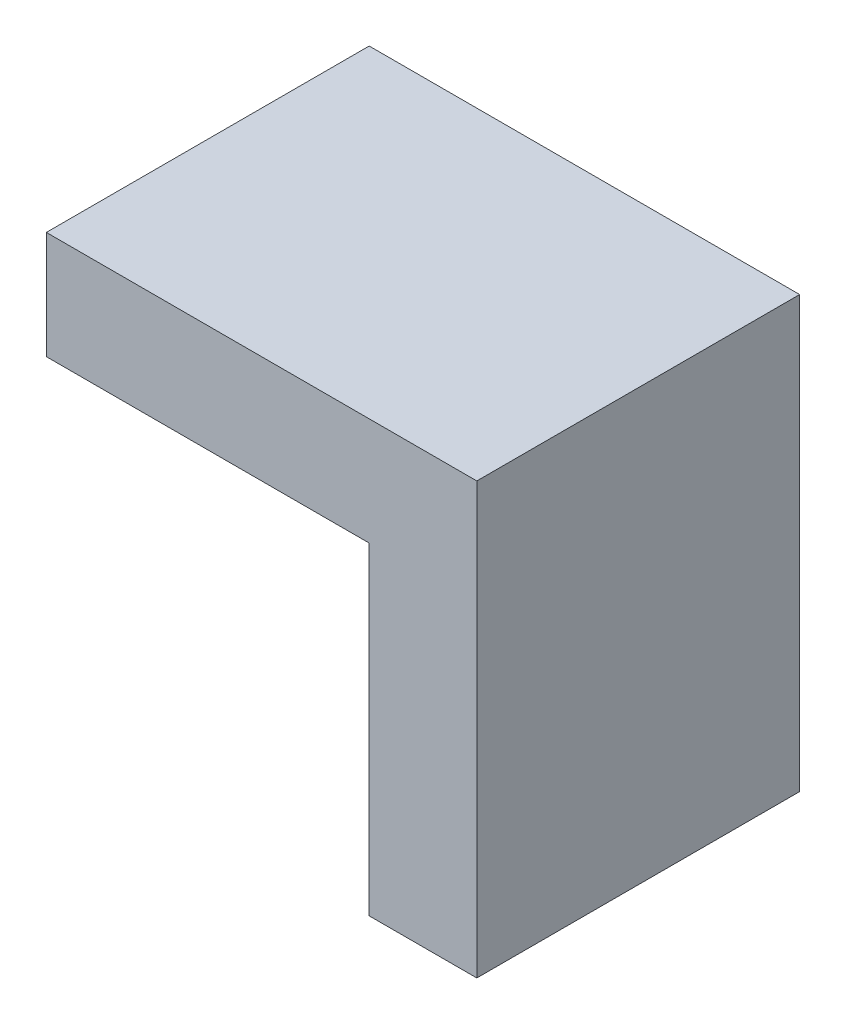
ISO-10303-21;
HEADER;
FILE_DESCRIPTION(('STEP AP214'),'2;1');
FILE_NAME('part.step','',(''),(''),'','','');
FILE_SCHEMA(('AUTOMOTIVE_DESIGN { 1 0 10303 214 1 1 1 1 }'));
ENDSEC;
DATA;
#1=APPLICATION_CONTEXT('core data for automotive mechanical design processes');
#2=APPLICATION_PROTOCOL_DEFINITION('international standard','automotive_design',2000,#1);
#3=PRODUCT_CONTEXT('',#1,'mechanical');
#4=PRODUCT('Part','Part','',(#3));
#5=PRODUCT_RELATED_PRODUCT_CATEGORY('part','',(#4));
#6=PRODUCT_DEFINITION_FORMATION('','',#4);
#7=PRODUCT_DEFINITION_CONTEXT('part definition',#1,'design');
#8=PRODUCT_DEFINITION('design','',#6,#7);
#9=PRODUCT_DEFINITION_SHAPE('','',#8);
#10=(LENGTH_UNIT() NAMED_UNIT(*) SI_UNIT(.MILLI.,.METRE.));
#11=(NAMED_UNIT(*) PLANE_ANGLE_UNIT() SI_UNIT($,.RADIAN.));
#12=(NAMED_UNIT(*) SI_UNIT($,.STERADIAN.) SOLID_ANGLE_UNIT());
#13=UNCERTAINTY_MEASURE_WITH_UNIT(LENGTH_MEASURE(1.E-05),#10,'distance_accuracy_value','');
#14=(GEOMETRIC_REPRESENTATION_CONTEXT(3) GLOBAL_UNCERTAINTY_ASSIGNED_CONTEXT((#13)) GLOBAL_UNIT_ASSIGNED_CONTEXT((#10,
#11,#12)) REPRESENTATION_CONTEXT('',''));
#15=CARTESIAN_POINT('',(0.,0.,0.));
#16=DIRECTION('',(0.,0.,1.));
#17=DIRECTION('',(1.,0.,0.));
#18=AXIS2_PLACEMENT_3D('',#15,#16,#17);
#19=CARTESIAN_POINT('',(-205.892458781285,91.7518961194131,1.11022302462516E-13));
#20=DIRECTION('',(0.,0.,1.));
#21=DIRECTION('',(1.,0.,0.));
#22=AXIS2_PLACEMENT_3D('',#19,#20,#21);
#23=PLANE('',#22);
#24=DIRECTION('',(0.,-1.,0.));
#25=VECTOR('',#24,1.);
#26=CARTESIAN_POINT('',(-195.892458781285,101.751896119413,0.));
#27=LINE('',#26,#25);
#28=CARTESIAN_POINT('',(-195.892458781285,101.751896119413,0.));
#29=VERTEX_POINT('',#28);
#30=CARTESIAN_POINT('',(-195.892458781285,71.7518961194131,0.));
#31=VERTEX_POINT('',#30);
#32=EDGE_CURVE('E27',#29,#31,#27,.T.);
#33=ORIENTED_EDGE('',*,*,#32,.F.);
#34=DIRECTION('',(1.,0.,0.));
#35=VECTOR('',#34,1.);
#36=CARTESIAN_POINT('',(-225.892458781285,101.751896119413,0.));
#37=LINE('',#36,#35);
#38=CARTESIAN_POINT('',(-225.892458781285,101.751896119413,0.));
#39=VERTEX_POINT('',#38);
#40=EDGE_CURVE('E89',#39,#29,#37,.T.);
#41=ORIENTED_EDGE('',*,*,#40,.F.);
#42=DIRECTION('',(0.,-1.,0.));
#43=VECTOR('',#42,1.);
#44=CARTESIAN_POINT('',(-225.892458781285,111.751896119413,0.));
#45=LINE('',#44,#43);
#46=CARTESIAN_POINT('',(-225.892458781285,111.751896119413,0.));
#47=VERTEX_POINT('',#46);
#48=EDGE_CURVE('E82',#47,#39,#45,.T.);
#49=ORIENTED_EDGE('',*,*,#48,.F.);
#50=DIRECTION('',(-1.,0.,0.));
#51=VECTOR('',#50,1.);
#52=CARTESIAN_POINT('',(-185.892458781285,111.751896119413,0.));
#53=LINE('',#52,#51);
#54=CARTESIAN_POINT('',(-185.892458781285,111.751896119413,0.));
#55=VERTEX_POINT('',#54);
#56=EDGE_CURVE('E66',#55,#47,#53,.T.);
#57=ORIENTED_EDGE('',*,*,#56,.F.);
#58=DIRECTION('',(0.,1.,0.));
#59=VECTOR('',#58,1.);
#60=CARTESIAN_POINT('',(-185.892458781285,71.7518961194131,0.));
#61=LINE('',#60,#59);
#62=CARTESIAN_POINT('',(-185.892458781285,71.7518961194131,0.));
#63=VERTEX_POINT('',#62);
#64=EDGE_CURVE('E113',#63,#55,#61,.T.);
#65=ORIENTED_EDGE('',*,*,#64,.F.);
#66=DIRECTION('',(1.,0.,0.));
#67=VECTOR('',#66,1.);
#68=CARTESIAN_POINT('',(-195.892458781285,71.7518961194131,0.));
#69=LINE('',#68,#67);
#70=EDGE_CURVE('E111',#31,#63,#69,.T.);
#71=ORIENTED_EDGE('',*,*,#70,.F.);
#72=EDGE_LOOP('',(#33,#41,#49,#57,#65,#71));
#73=FACE_BOUND('',#72,.T.);
#74=ADVANCED_FACE('F16',(#73),#23,.F.);
#75=CARTESIAN_POINT('',(-205.892458781285,91.7518961194131,30.0000000000001));
#76=DIRECTION('',(0.,0.,1.));
#77=DIRECTION('',(1.,0.,0.));
#78=AXIS2_PLACEMENT_3D('',#75,#76,#77);
#79=PLANE('',#78);
#80=DIRECTION('',(0.,-1.,0.));
#81=VECTOR('',#80,1.);
#82=CARTESIAN_POINT('',(-195.892458781285,101.751896119413,30.));
#83=LINE('',#82,#81);
#84=CARTESIAN_POINT('',(-195.892458781285,101.751896119413,30.));
#85=VERTEX_POINT('',#84);
#86=CARTESIAN_POINT('',(-195.892458781285,71.7518961194131,30.));
#87=VERTEX_POINT('',#86);
#88=EDGE_CURVE('E11',#85,#87,#83,.T.);
#89=ORIENTED_EDGE('',*,*,#88,.T.);
#90=DIRECTION('',(1.,0.,0.));
#91=VECTOR('',#90,1.);
#92=CARTESIAN_POINT('',(-195.892458781285,71.7518961194131,30.));
#93=LINE('',#92,#91);
#94=CARTESIAN_POINT('',(-185.892458781285,71.7518961194131,30.));
#95=VERTEX_POINT('',#94);
#96=EDGE_CURVE('E133',#87,#95,#93,.T.);
#97=ORIENTED_EDGE('',*,*,#96,.T.);
#98=DIRECTION('',(0.,1.,0.));
#99=VECTOR('',#98,1.);
#100=CARTESIAN_POINT('',(-185.892458781285,71.7518961194131,30.));
#101=LINE('',#100,#99);
#102=CARTESIAN_POINT('',(-185.892458781285,111.751896119413,29.9999999999999));
#103=VERTEX_POINT('',#102);
#104=EDGE_CURVE('E102',#95,#103,#101,.T.);
#105=ORIENTED_EDGE('',*,*,#104,.T.);
#106=DIRECTION('',(-1.,0.,0.));
#107=VECTOR('',#106,1.);
#108=CARTESIAN_POINT('',(-185.892458781285,111.751896119413,29.9999999999999));
#109=LINE('',#108,#107);
#110=CARTESIAN_POINT('',(-225.892458781285,111.751896119413,29.9999999999999));
#111=VERTEX_POINT('',#110);
#112=EDGE_CURVE('E78',#103,#111,#109,.T.);
#113=ORIENTED_EDGE('',*,*,#112,.T.);
#114=DIRECTION('',(0.,-1.,0.));
#115=VECTOR('',#114,1.);
#116=CARTESIAN_POINT('',(-225.892458781285,111.751896119413,29.9999999999999));
#117=LINE('',#116,#115);
#118=CARTESIAN_POINT('',(-225.892458781285,101.751896119413,30.));
#119=VERTEX_POINT('',#118);
#120=EDGE_CURVE('E84',#111,#119,#117,.T.);
#121=ORIENTED_EDGE('',*,*,#120,.T.);
#122=DIRECTION('',(1.,0.,0.));
#123=VECTOR('',#122,1.);
#124=CARTESIAN_POINT('',(-225.892458781285,101.751896119413,30.));
#125=LINE('',#124,#123);
#126=EDGE_CURVE('E99',#119,#85,#125,.T.);
#127=ORIENTED_EDGE('',*,*,#126,.T.);
#128=EDGE_LOOP('',(#89,#97,#105,#113,#121,#127));
#129=FACE_BOUND('',#128,.T.);
#130=ADVANCED_FACE('F152',(#129),#79,.T.);
#131=CARTESIAN_POINT('',(-195.892458781285,101.751896119413,0.));
#132=DIRECTION('',(-1.,0.,0.));
#133=DIRECTION('',(0.,-1.,0.));
#134=AXIS2_PLACEMENT_3D('',#131,#132,#133);
#135=PLANE('',#134);
#136=ORIENTED_EDGE('',*,*,#32,.T.);
#137=DIRECTION('',(0.,0.,1.));
#138=VECTOR('',#137,1.);
#139=CARTESIAN_POINT('',(-195.892458781285,71.7518961194131,0.));
#140=LINE('',#139,#138);
#141=EDGE_CURVE('E20',#31,#87,#140,.T.);
#142=ORIENTED_EDGE('',*,*,#141,.T.);
#143=ORIENTED_EDGE('',*,*,#88,.F.);
#144=DIRECTION('',(0.,0.,1.));
#145=VECTOR('',#144,1.);
#146=CARTESIAN_POINT('',(-195.892458781285,101.751896119413,0.));
#147=LINE('',#146,#145);
#148=EDGE_CURVE('E117',#29,#85,#147,.T.);
#149=ORIENTED_EDGE('',*,*,#148,.F.);
#150=EDGE_LOOP('',(#136,#142,#143,#149));
#151=FACE_BOUND('',#150,.T.);
#152=ADVANCED_FACE('F166',(#151),#135,.T.);
#153=CARTESIAN_POINT('',(-195.892458781285,71.7518961194131,0.));
#154=DIRECTION('',(0.,-1.,0.));
#155=DIRECTION('',(1.,0.,0.));
#156=AXIS2_PLACEMENT_3D('',#153,#154,#155);
#157=PLANE('',#156);
#158=ORIENTED_EDGE('',*,*,#70,.T.);
#159=DIRECTION('',(0.,0.,1.));
#160=VECTOR('',#159,1.);
#161=CARTESIAN_POINT('',(-185.892458781285,71.7518961194131,0.));
#162=LINE('',#161,#160);
#163=EDGE_CURVE('E108',#63,#95,#162,.T.);
#164=ORIENTED_EDGE('',*,*,#163,.T.);
#165=ORIENTED_EDGE('',*,*,#96,.F.);
#166=ORIENTED_EDGE('',*,*,#141,.F.);
#167=EDGE_LOOP('',(#158,#164,#165,#166));
#168=FACE_BOUND('',#167,.T.);
#169=ADVANCED_FACE('F143',(#168),#157,.T.);
#170=CARTESIAN_POINT('',(-185.892458781285,71.7518961194131,0.));
#171=DIRECTION('',(1.,0.,0.));
#172=DIRECTION('',(0.,1.,0.));
#173=AXIS2_PLACEMENT_3D('',#170,#171,#172);
#174=PLANE('',#173);
#175=ORIENTED_EDGE('',*,*,#64,.T.);
#176=DIRECTION('',(0.,0.,1.));
#177=VECTOR('',#176,1.);
#178=CARTESIAN_POINT('',(-185.892458781285,111.751896119413,0.));
#179=LINE('',#178,#177);
#180=EDGE_CURVE('E73',#55,#103,#179,.T.);
#181=ORIENTED_EDGE('',*,*,#180,.T.);
#182=ORIENTED_EDGE('',*,*,#104,.F.);
#183=ORIENTED_EDGE('',*,*,#163,.F.);
#184=EDGE_LOOP('',(#175,#181,#182,#183));
#185=FACE_BOUND('',#184,.T.);
#186=ADVANCED_FACE('F146',(#185),#174,.T.);
#187=CARTESIAN_POINT('',(-185.892458781285,111.751896119413,0.));
#188=DIRECTION('',(0.,1.,0.));
#189=DIRECTION('',(-1.,0.,0.));
#190=AXIS2_PLACEMENT_3D('',#187,#188,#189);
#191=PLANE('',#190);
#192=ORIENTED_EDGE('',*,*,#56,.T.);
#193=DIRECTION('',(0.,0.,1.));
#194=VECTOR('',#193,1.);
#195=CARTESIAN_POINT('',(-225.892458781285,111.751896119413,0.));
#196=LINE('',#195,#194);
#197=EDGE_CURVE('E70',#47,#111,#196,.T.);
#198=ORIENTED_EDGE('',*,*,#197,.T.);
#199=ORIENTED_EDGE('',*,*,#112,.F.);
#200=ORIENTED_EDGE('',*,*,#180,.F.);
#201=EDGE_LOOP('',(#192,#198,#199,#200));
#202=FACE_BOUND('',#201,.T.);
#203=ADVANCED_FACE('F68',(#202),#191,.T.);
#204=CARTESIAN_POINT('',(-225.892458781285,111.751896119413,0.));
#205=DIRECTION('',(-1.,0.,0.));
#206=DIRECTION('',(0.,-1.,0.));
#207=AXIS2_PLACEMENT_3D('',#204,#205,#206);
#208=PLANE('',#207);
#209=ORIENTED_EDGE('',*,*,#48,.T.);
#210=DIRECTION('',(0.,0.,1.));
#211=VECTOR('',#210,1.);
#212=CARTESIAN_POINT('',(-225.892458781285,101.751896119413,0.));
#213=LINE('',#212,#211);
#214=EDGE_CURVE('E91',#39,#119,#213,.T.);
#215=ORIENTED_EDGE('',*,*,#214,.T.);
#216=ORIENTED_EDGE('',*,*,#120,.F.);
#217=ORIENTED_EDGE('',*,*,#197,.F.);
#218=EDGE_LOOP('',(#209,#215,#216,#217));
#219=FACE_BOUND('',#218,.T.);
#220=ADVANCED_FACE('F18',(#219),#208,.T.);
#221=CARTESIAN_POINT('',(-225.892458781285,101.751896119413,0.));
#222=DIRECTION('',(0.,-1.,0.));
#223=DIRECTION('',(1.,0.,0.));
#224=AXIS2_PLACEMENT_3D('',#221,#222,#223);
#225=PLANE('',#224);
#226=ORIENTED_EDGE('',*,*,#40,.T.);
#227=ORIENTED_EDGE('',*,*,#148,.T.);
#228=ORIENTED_EDGE('',*,*,#126,.F.);
#229=ORIENTED_EDGE('',*,*,#214,.F.);
#230=EDGE_LOOP('',(#226,#227,#228,#229));
#231=FACE_BOUND('',#230,.T.);
#232=ADVANCED_FACE('F153',(#231),#225,.T.);
#233=CLOSED_SHELL('',(#74,#130,#152,#169,#186,#203,#220,#232));
#234=MANIFOLD_SOLID_BREP('B1',#233);
#235=ADVANCED_BREP_SHAPE_REPRESENTATION('',(#18,#234),#14);
#236=SHAPE_DEFINITION_REPRESENTATION(#9,#235);
ENDSEC;
END-ISO-10303-21;
